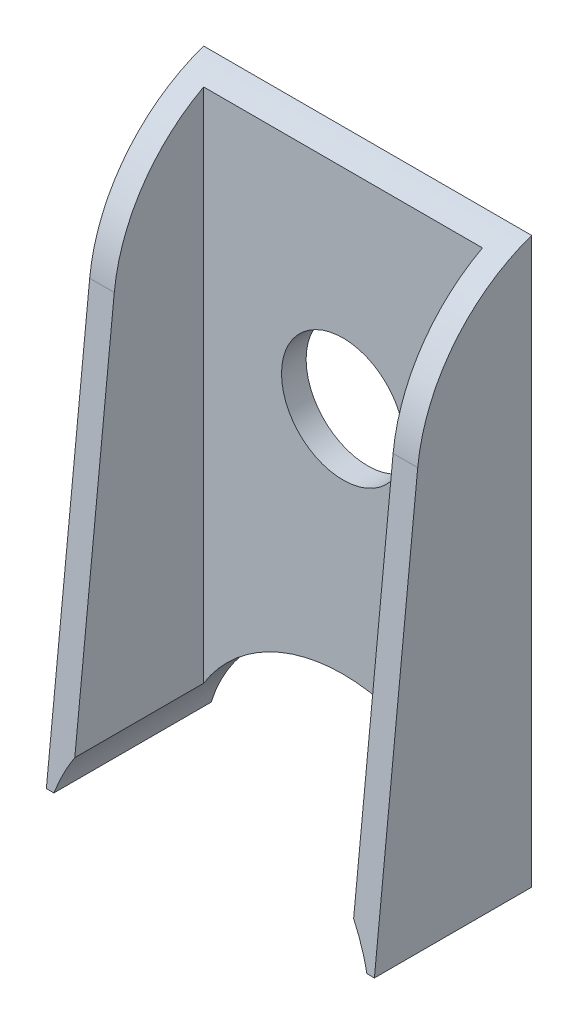
ISO-10303-21;
HEADER;
FILE_DESCRIPTION(('STEP AP214'),'2;1');
FILE_NAME('part.step','',(''),(''),'','','');
FILE_SCHEMA(('AUTOMOTIVE_DESIGN { 1 0 10303 214 1 1 1 1 }'));
ENDSEC;
DATA;
#1=APPLICATION_CONTEXT('core data for automotive mechanical design processes');
#2=APPLICATION_PROTOCOL_DEFINITION('international standard','automotive_design',2000,#1);
#3=PRODUCT_CONTEXT('',#1,'mechanical');
#4=PRODUCT('Part','Part','',(#3));
#5=PRODUCT_RELATED_PRODUCT_CATEGORY('part','',(#4));
#6=PRODUCT_DEFINITION_FORMATION('','',#4);
#7=PRODUCT_DEFINITION_CONTEXT('part definition',#1,'design');
#8=PRODUCT_DEFINITION('design','',#6,#7);
#9=PRODUCT_DEFINITION_SHAPE('','',#8);
#10=(LENGTH_UNIT() NAMED_UNIT(*) SI_UNIT(.MILLI.,.METRE.));
#11=(NAMED_UNIT(*) PLANE_ANGLE_UNIT() SI_UNIT($,.RADIAN.));
#12=(NAMED_UNIT(*) SI_UNIT($,.STERADIAN.) SOLID_ANGLE_UNIT());
#13=UNCERTAINTY_MEASURE_WITH_UNIT(LENGTH_MEASURE(1.E-05),#10,'distance_accuracy_value','');
#14=(GEOMETRIC_REPRESENTATION_CONTEXT(3) GLOBAL_UNCERTAINTY_ASSIGNED_CONTEXT((#13)) GLOBAL_UNIT_ASSIGNED_CONTEXT((#10,
#11,#12)) REPRESENTATION_CONTEXT('',''));
#15=CARTESIAN_POINT('',(0.,0.,0.));
#16=DIRECTION('',(0.,0.,1.));
#17=DIRECTION('',(1.,0.,0.));
#18=AXIS2_PLACEMENT_3D('',#15,#16,#17);
#19=CARTESIAN_POINT('',(-12.7,49.53,0.));
#20=DIRECTION('',(1.,0.,0.));
#21=DIRECTION('',(0.,0.,-1.));
#22=AXIS2_PLACEMENT_3D('',#19,#20,#21);
#23=PLANE('',#22);
#24=DIRECTION('',(0.,-1.,0.));
#25=VECTOR('',#24,1.);
#26=CARTESIAN_POINT('',(-12.7,49.53,0.));
#27=LINE('',#26,#25);
#28=CARTESIAN_POINT('',(-12.7,48.7880374490231,0.));
#29=VERTEX_POINT('',#28);
#30=CARTESIAN_POINT('',(-12.7,5.08,0.));
#31=VERTEX_POINT('',#30);
#32=EDGE_CURVE('E185',#29,#31,#27,.T.);
#33=ORIENTED_EDGE('',*,*,#32,.T.);
#34=DIRECTION('',(0.,0.,-1.));
#35=VECTOR('',#34,1.);
#36=CARTESIAN_POINT('',(-12.7,5.08,44.45));
#37=LINE('',#36,#35);
#38=CARTESIAN_POINT('',(-12.7,5.08,12.1763798862728));
#39=VERTEX_POINT('',#38);
#40=EDGE_CURVE('E128',#39,#31,#37,.T.);
#41=ORIENTED_EDGE('',*,*,#40,.F.);
#42=DIRECTION('',(0.,0.994729748210464,-0.102531595253102));
#43=VECTOR('',#42,1.);
#44=CARTESIAN_POINT('',(-12.7,50.3045931756222,7.51486283472083));
#45=LINE('',#44,#43);
#46=CARTESIAN_POINT('',(-12.7,37.6239468569937,8.82191824170788));
#47=VERTEX_POINT('',#46);
#48=EDGE_CURVE('E174',#39,#47,#45,.T.);
#49=ORIENTED_EDGE('',*,*,#48,.T.);
#50=CARTESIAN_POINT('',(-12.7,36.2637356055849,-4.37442959904211));
#51=DIRECTION('',(1.,0.,0.));
#52=DIRECTION('',(0.,0.,-1.));
#53=AXIS2_PLACEMENT_3D('',#50,#51,#52);
#54=CIRCLE('',#53,13.2662643944151);
#55=EDGE_CURVE('E176',#47,#29,#54,.F.);
#56=ORIENTED_EDGE('',*,*,#55,.T.);
#57=EDGE_LOOP('',(#33,#41,#49,#56));
#58=FACE_BOUND('',#57,.T.);
#59=ADVANCED_FACE('F41',(#58),#23,.F.);
#60=CARTESIAN_POINT('',(-10.795,49.53,12.7));
#61=DIRECTION('',(-1.,0.,0.));
#62=DIRECTION('',(0.,0.,1.));
#63=AXIS2_PLACEMENT_3D('',#60,#61,#62);
#64=PLANE('',#63);
#65=DIRECTION('',(0.,-0.994729748210464,0.102531595253102));
#66=VECTOR('',#65,1.);
#67=CARTESIAN_POINT('',(-10.795,49.0093045809145,7.64837448064018));
#68=LINE('',#67,#66);
#69=CARTESIAN_POINT('',(-10.795,37.6239468569937,8.82191824170788));
#70=VERTEX_POINT('',#69);
#71=CARTESIAN_POINT('',(-10.795,7.96014013306148,11.8795099445358));
#72=VERTEX_POINT('',#71);
#73=EDGE_CURVE('E171',#70,#72,#68,.T.);
#74=ORIENTED_EDGE('',*,*,#73,.T.);
#75=DIRECTION('',(0.,0.,-1.));
#76=VECTOR('',#75,1.);
#77=CARTESIAN_POINT('',(-10.795,7.96014013306148,44.45));
#78=LINE('',#77,#76);
#79=CARTESIAN_POINT('',(-10.795,7.9601401330615,1.905));
#80=VERTEX_POINT('',#79);
#81=EDGE_CURVE('E154',#72,#80,#78,.T.);
#82=ORIENTED_EDGE('',*,*,#81,.T.);
#83=DIRECTION('',(0.,-1.,0.));
#84=VECTOR('',#83,1.);
#85=CARTESIAN_POINT('',(-10.795,49.53,1.905));
#86=LINE('',#85,#84);
#87=CARTESIAN_POINT('',(-10.795,47.9497329910544,1.90500000000001));
#88=VERTEX_POINT('',#87);
#89=EDGE_CURVE('E192',#88,#80,#86,.T.);
#90=ORIENTED_EDGE('',*,*,#89,.F.);
#91=CARTESIAN_POINT('',(-10.795,36.2637356055849,-4.37442959904211));
#92=DIRECTION('',(-1.,0.,0.));
#93=DIRECTION('',(0.,0.,1.));
#94=AXIS2_PLACEMENT_3D('',#91,#92,#93);
#95=CIRCLE('',#94,13.2662643944151);
#96=EDGE_CURVE('E63',#88,#70,#95,.F.);
#97=ORIENTED_EDGE('',*,*,#96,.T.);
#98=EDGE_LOOP('',(#74,#82,#90,#97));
#99=FACE_BOUND('',#98,.T.);
#100=ADVANCED_FACE('F213',(#99),#64,.F.);
#101=CARTESIAN_POINT('',(-10.795,49.53,1.905));
#102=DIRECTION('',(0.,0.,-1.));
#103=DIRECTION('',(-1.,0.,0.));
#104=AXIS2_PLACEMENT_3D('',#101,#102,#103);
#105=PLANE('',#104);
#106=CARTESIAN_POINT('',(0.,31.75,1.905));
#107=DIRECTION('',(0.,0.,-1.));
#108=DIRECTION('',(-1.,0.,0.));
#109=AXIS2_PLACEMENT_3D('',#106,#107,#108);
#110=CIRCLE('',#109,4.7625);
#111=CARTESIAN_POINT('',(-4.7625,31.75,1.905));
#112=VERTEX_POINT('',#111);
#113=EDGE_CURVE('E158',#112,#112,#110,.T.);
#114=ORIENTED_EDGE('',*,*,#113,.T.);
#115=EDGE_LOOP('',(#114));
#116=FACE_BOUND('',#115,.T.);
#117=ORIENTED_EDGE('',*,*,#89,.T.);
#118=CARTESIAN_POINT('',(0.,1.27,1.905));
#119=DIRECTION('',(0.,0.,-1.));
#120=DIRECTION('',(-1.,0.,0.));
#121=AXIS2_PLACEMENT_3D('',#118,#119,#120);
#122=CIRCLE('',#121,12.7);
#123=CARTESIAN_POINT('',(10.795,7.96014013306154,1.905));
#124=VERTEX_POINT('',#123);
#125=EDGE_CURVE('E151',#80,#124,#122,.T.);
#126=ORIENTED_EDGE('',*,*,#125,.T.);
#127=DIRECTION('',(0.,-1.,0.));
#128=VECTOR('',#127,1.);
#129=CARTESIAN_POINT('',(10.795,49.53,1.905));
#130=LINE('',#129,#128);
#131=CARTESIAN_POINT('',(10.795,47.9497329910544,1.905));
#132=VERTEX_POINT('',#131);
#133=EDGE_CURVE('E189',#132,#124,#130,.T.);
#134=ORIENTED_EDGE('',*,*,#133,.F.);
#135=DIRECTION('',(1.,0.,0.));
#136=VECTOR('',#135,1.);
#137=CARTESIAN_POINT('',(-31.75,47.9497329910544,1.90500000000001));
#138=LINE('',#137,#136);
#139=EDGE_CURVE('E182',#132,#88,#138,.F.);
#140=ORIENTED_EDGE('',*,*,#139,.T.);
#141=EDGE_LOOP('',(#117,#126,#134,#140));
#142=FACE_BOUND('',#141,.T.);
#143=ADVANCED_FACE('F210',(#116,#142),#105,.F.);
#144=CARTESIAN_POINT('',(10.795,49.53,1.905));
#145=DIRECTION('',(1.,0.,0.));
#146=DIRECTION('',(0.,0.,-1.));
#147=AXIS2_PLACEMENT_3D('',#144,#145,#146);
#148=PLANE('',#147);
#149=ORIENTED_EDGE('',*,*,#133,.T.);
#150=DIRECTION('',(0.,0.,-1.));
#151=VECTOR('',#150,1.);
#152=CARTESIAN_POINT('',(10.795,7.96014013306154,44.45));
#153=LINE('',#152,#151);
#154=CARTESIAN_POINT('',(10.795,7.96014013306149,11.8795099445359));
#155=VERTEX_POINT('',#154);
#156=EDGE_CURVE('E145',#124,#155,#153,.F.);
#157=ORIENTED_EDGE('',*,*,#156,.T.);
#158=DIRECTION('',(0.,0.994729748210464,-0.102531595253102));
#159=VECTOR('',#158,1.);
#160=CARTESIAN_POINT('',(10.795,50.110299886416,7.53488958160874));
#161=LINE('',#160,#159);
#162=CARTESIAN_POINT('',(10.795,37.6239468569937,8.82191824170788));
#163=VERTEX_POINT('',#162);
#164=EDGE_CURVE('E169',#155,#163,#161,.T.);
#165=ORIENTED_EDGE('',*,*,#164,.T.);
#166=CARTESIAN_POINT('',(10.795,36.2637356055849,-4.3744295990421));
#167=DIRECTION('',(1.,0.,0.));
#168=DIRECTION('',(0.,0.,-1.));
#169=AXIS2_PLACEMENT_3D('',#166,#167,#168);
#170=CIRCLE('',#169,13.2662643944151);
#171=EDGE_CURVE('E179',#163,#132,#170,.F.);
#172=ORIENTED_EDGE('',*,*,#171,.T.);
#173=EDGE_LOOP('',(#149,#157,#165,#172));
#174=FACE_BOUND('',#173,.T.);
#175=ADVANCED_FACE('F206',(#174),#148,.F.);
#176=CARTESIAN_POINT('',(12.7,49.53,12.7));
#177=DIRECTION('',(-1.,0.,0.));
#178=DIRECTION('',(0.,0.,1.));
#179=AXIS2_PLACEMENT_3D('',#176,#177,#178);
#180=PLANE('',#179);
#181=DIRECTION('',(0.,0.994729748210464,-0.102531595253102));
#182=VECTOR('',#181,1.);
#183=CARTESIAN_POINT('',(12.7,0.,12.7));
#184=LINE('',#183,#182);
#185=CARTESIAN_POINT('',(12.7,5.07999999999999,12.1763798862728));
#186=VERTEX_POINT('',#185);
#187=CARTESIAN_POINT('',(12.7,37.6239468569937,8.82191824170788));
#188=VERTEX_POINT('',#187);
#189=EDGE_CURVE('E161',#186,#188,#184,.T.);
#190=ORIENTED_EDGE('',*,*,#189,.F.);
#191=DIRECTION('',(0.,0.,-1.));
#192=VECTOR('',#191,1.);
#193=CARTESIAN_POINT('',(12.7,5.07999999999999,44.45));
#194=LINE('',#193,#192);
#195=CARTESIAN_POINT('',(12.7,5.07999999999999,0.));
#196=VERTEX_POINT('',#195);
#197=EDGE_CURVE('E55',#186,#196,#194,.T.);
#198=ORIENTED_EDGE('',*,*,#197,.T.);
#199=DIRECTION('',(0.,-1.,0.));
#200=VECTOR('',#199,1.);
#201=CARTESIAN_POINT('',(12.7,49.53,0.));
#202=LINE('',#201,#200);
#203=CARTESIAN_POINT('',(12.7,48.7880374490231,0.));
#204=VERTEX_POINT('',#203);
#205=EDGE_CURVE('E187',#204,#196,#202,.T.);
#206=ORIENTED_EDGE('',*,*,#205,.F.);
#207=CARTESIAN_POINT('',(12.7,36.2637356055849,-4.3744295990421));
#208=DIRECTION('',(-1.,0.,0.));
#209=DIRECTION('',(0.,0.,1.));
#210=AXIS2_PLACEMENT_3D('',#207,#208,#209);
#211=CIRCLE('',#210,13.2662643944151);
#212=EDGE_CURVE('E163',#188,#204,#211,.T.);
#213=ORIENTED_EDGE('',*,*,#212,.F.);
#214=EDGE_LOOP('',(#190,#198,#206,#213));
#215=FACE_BOUND('',#214,.T.);
#216=ADVANCED_FACE('F224',(#215),#180,.F.);
#217=CARTESIAN_POINT('',(12.7,49.53,0.));
#218=DIRECTION('',(0.,0.,1.));
#219=DIRECTION('',(1.,0.,0.));
#220=AXIS2_PLACEMENT_3D('',#217,#218,#219);
#221=PLANE('',#220);
#222=CARTESIAN_POINT('',(0.,31.75,0.));
#223=DIRECTION('',(0.,0.,-1.));
#224=DIRECTION('',(-1.,0.,0.));
#225=AXIS2_PLACEMENT_3D('',#222,#223,#224);
#226=CIRCLE('',#225,4.7625);
#227=CARTESIAN_POINT('',(-4.7625,31.75,0.));
#228=VERTEX_POINT('',#227);
#229=EDGE_CURVE('E142',#228,#228,#226,.T.);
#230=ORIENTED_EDGE('',*,*,#229,.F.);
#231=EDGE_LOOP('',(#230));
#232=FACE_BOUND('',#231,.T.);
#233=CARTESIAN_POINT('',(0.,1.27,0.));
#234=DIRECTION('',(0.,0.,-1.));
#235=DIRECTION('',(-1.,0.,0.));
#236=AXIS2_PLACEMENT_3D('',#233,#234,#235);
#237=CIRCLE('',#236,12.7);
#238=CARTESIAN_POINT('',(-12.1150278579952,5.08,0.));
#239=VERTEX_POINT('',#238);
#240=CARTESIAN_POINT('',(12.1150278579952,5.07999999999999,0.));
#241=VERTEX_POINT('',#240);
#242=EDGE_CURVE('E123',#239,#241,#237,.T.);
#243=ORIENTED_EDGE('',*,*,#242,.F.);
#244=DIRECTION('',(1.,0.,0.));
#245=VECTOR('',#244,1.);
#246=CARTESIAN_POINT('',(-12.1150278579952,5.08,0.));
#247=LINE('',#246,#245);
#248=EDGE_CURVE('E131',#31,#239,#247,.T.);
#249=ORIENTED_EDGE('',*,*,#248,.F.);
#250=ORIENTED_EDGE('',*,*,#32,.F.);
#251=DIRECTION('',(1.,0.,0.));
#252=VECTOR('',#251,1.);
#253=CARTESIAN_POINT('',(-31.75,48.7880374490231,0.));
#254=LINE('',#253,#252);
#255=EDGE_CURVE('E195',#29,#204,#254,.T.);
#256=ORIENTED_EDGE('',*,*,#255,.T.);
#257=ORIENTED_EDGE('',*,*,#205,.T.);
#258=DIRECTION('',(1.,0.,0.));
#259=VECTOR('',#258,1.);
#260=CARTESIAN_POINT('',(12.1150278579952,5.07999999999999,0.));
#261=LINE('',#260,#259);
#262=EDGE_CURVE('E137',#241,#196,#261,.T.);
#263=ORIENTED_EDGE('',*,*,#262,.F.);
#264=EDGE_LOOP('',(#243,#249,#250,#256,#257,#263));
#265=FACE_BOUND('',#264,.T.);
#266=ADVANCED_FACE('F140',(#232,#265),#221,.F.);
#267=CARTESIAN_POINT('',(-31.75,36.2637356055849,-4.37442959904211));
#268=DIRECTION('',(1.,0.,0.));
#269=DIRECTION('',(0.,0.,-1.));
#270=AXIS2_PLACEMENT_3D('',#267,#268,#269);
#271=CYLINDRICAL_SURFACE('',#270,13.2662643944151);
#272=ORIENTED_EDGE('',*,*,#139,.F.);
#273=ORIENTED_EDGE('',*,*,#171,.F.);
#274=DIRECTION('',(1.,0.,0.));
#275=VECTOR('',#274,1.);
#276=CARTESIAN_POINT('',(-31.75,37.6239468569937,8.82191824170788));
#277=LINE('',#276,#275);
#278=EDGE_CURVE('E165',#163,#188,#277,.T.);
#279=ORIENTED_EDGE('',*,*,#278,.T.);
#280=ORIENTED_EDGE('',*,*,#212,.T.);
#281=ORIENTED_EDGE('',*,*,#255,.F.);
#282=ORIENTED_EDGE('',*,*,#55,.F.);
#283=EDGE_CURVE('E168',#47,#70,#277,.T.);
#284=ORIENTED_EDGE('',*,*,#283,.T.);
#285=ORIENTED_EDGE('',*,*,#96,.F.);
#286=EDGE_LOOP('',(#272,#273,#279,#280,#281,#282,#284,#285));
#287=FACE_BOUND('',#286,.T.);
#288=ADVANCED_FACE('F219',(#287),#271,.T.);
#289=CARTESIAN_POINT('',(-31.75,0.,12.7));
#290=DIRECTION('',(0.,-0.102531595253102,-0.994729748210464));
#291=DIRECTION('',(0.,0.994729748210464,-0.102531595253102));
#292=AXIS2_PLACEMENT_3D('',#289,#290,#291);
#293=PLANE('',#292);
#294=DIRECTION('',(1.,0.,0.));
#295=VECTOR('',#294,1.);
#296=CARTESIAN_POINT('',(-31.75,5.08000000000003,12.1763798862728));
#297=LINE('',#296,#295);
#298=CARTESIAN_POINT('',(-12.1150278579952,5.08,12.1763798862728));
#299=VERTEX_POINT('',#298);
#300=EDGE_CURVE('E11',#39,#299,#297,.T.);
#301=ORIENTED_EDGE('',*,*,#300,.T.);
#302=CARTESIAN_POINT('',(0.,1.27,12.5690949715682));
#303=DIRECTION('',(0.,-0.102531595253102,-0.994729748210464));
#304=DIRECTION('',(0.,0.994729748210464,-0.102531595253102));
#305=AXIS2_PLACEMENT_3D('',#302,#303,#304);
#306=ELLIPSE('',#305,12.7672868161905,12.7);
#307=EDGE_CURVE('E126',#299,#72,#306,.T.);
#308=ORIENTED_EDGE('',*,*,#307,.T.);
#309=ORIENTED_EDGE('',*,*,#73,.F.);
#310=ORIENTED_EDGE('',*,*,#283,.F.);
#311=ORIENTED_EDGE('',*,*,#48,.F.);
#312=EDGE_LOOP('',(#301,#308,#309,#310,#311));
#313=FACE_BOUND('',#312,.T.);
#314=ADVANCED_FACE('F216',(#313),#293,.F.);
#315=ORIENTED_EDGE('',*,*,#164,.F.);
#316=CARTESIAN_POINT('',(0.,1.27,12.5690949715682));
#317=DIRECTION('',(0.,-0.102531595253102,-0.994729748210464));
#318=DIRECTION('',(0.,0.994729748210464,-0.102531595253102));
#319=AXIS2_PLACEMENT_3D('',#316,#317,#318);
#320=ELLIPSE('',#319,12.7672868161905,12.7);
#321=CARTESIAN_POINT('',(12.1150278579952,5.07999999999999,12.1763798862728));
#322=VERTEX_POINT('',#321);
#323=EDGE_CURVE('E48',#155,#322,#320,.T.);
#324=ORIENTED_EDGE('',*,*,#323,.T.);
#325=DIRECTION('',(1.,0.,0.));
#326=VECTOR('',#325,1.);
#327=CARTESIAN_POINT('',(-31.75,5.07999999999999,12.1763798862728));
#328=LINE('',#327,#326);
#329=EDGE_CURVE('E198',#322,#186,#328,.T.);
#330=ORIENTED_EDGE('',*,*,#329,.T.);
#331=ORIENTED_EDGE('',*,*,#189,.T.);
#332=ORIENTED_EDGE('',*,*,#278,.F.);
#333=EDGE_LOOP('',(#315,#324,#330,#331,#332));
#334=FACE_BOUND('',#333,.T.);
#335=ADVANCED_FACE('F202',(#334),#293,.F.);
#336=CARTESIAN_POINT('',(-12.1150278579952,5.08,44.45));
#337=DIRECTION('',(0.,1.,0.));
#338=DIRECTION('',(-1.,0.,0.));
#339=AXIS2_PLACEMENT_3D('',#336,#337,#338);
#340=PLANE('',#339);
#341=ORIENTED_EDGE('',*,*,#40,.T.);
#342=ORIENTED_EDGE('',*,*,#248,.T.);
#343=DIRECTION('',(0.,0.,-1.));
#344=VECTOR('',#343,1.);
#345=CARTESIAN_POINT('',(-12.1150278579952,5.08,44.45));
#346=LINE('',#345,#344);
#347=EDGE_CURVE('E118',#299,#239,#346,.T.);
#348=ORIENTED_EDGE('',*,*,#347,.F.);
#349=ORIENTED_EDGE('',*,*,#300,.F.);
#350=EDGE_LOOP('',(#341,#342,#348,#349));
#351=FACE_BOUND('',#350,.T.);
#352=ADVANCED_FACE('F132',(#351),#340,.F.);
#353=CARTESIAN_POINT('',(0.,1.27,44.45));
#354=DIRECTION('',(0.,0.,-1.));
#355=DIRECTION('',(-1.,0.,0.));
#356=AXIS2_PLACEMENT_3D('',#353,#354,#355);
#357=CYLINDRICAL_SURFACE('',#356,12.7);
#358=ORIENTED_EDGE('',*,*,#347,.T.);
#359=ORIENTED_EDGE('',*,*,#242,.T.);
#360=DIRECTION('',(0.,0.,-1.));
#361=VECTOR('',#360,1.);
#362=CARTESIAN_POINT('',(12.1150278579952,5.07999999999999,44.45));
#363=LINE('',#362,#361);
#364=EDGE_CURVE('E138',#322,#241,#363,.T.);
#365=ORIENTED_EDGE('',*,*,#364,.F.);
#366=ORIENTED_EDGE('',*,*,#323,.F.);
#367=ORIENTED_EDGE('',*,*,#156,.F.);
#368=ORIENTED_EDGE('',*,*,#125,.F.);
#369=ORIENTED_EDGE('',*,*,#81,.F.);
#370=ORIENTED_EDGE('',*,*,#307,.F.);
#371=EDGE_LOOP('',(#358,#359,#365,#366,#367,#368,#369,#370));
#372=FACE_BOUND('',#371,.T.);
#373=ADVANCED_FACE('F120',(#372),#357,.F.);
#374=CARTESIAN_POINT('',(12.1150278579952,5.07999999999999,44.45));
#375=DIRECTION('',(0.,1.,0.));
#376=DIRECTION('',(0.,0.,1.));
#377=AXIS2_PLACEMENT_3D('',#374,#375,#376);
#378=PLANE('',#377);
#379=ORIENTED_EDGE('',*,*,#364,.T.);
#380=ORIENTED_EDGE('',*,*,#262,.T.);
#381=ORIENTED_EDGE('',*,*,#197,.F.);
#382=ORIENTED_EDGE('',*,*,#329,.F.);
#383=EDGE_LOOP('',(#379,#380,#381,#382));
#384=FACE_BOUND('',#383,.T.);
#385=ADVANCED_FACE('F228',(#384),#378,.F.);
#386=CARTESIAN_POINT('',(0.,31.75,44.45));
#387=DIRECTION('',(0.,0.,-1.));
#388=DIRECTION('',(-1.,0.,0.));
#389=AXIS2_PLACEMENT_3D('',#386,#387,#388);
#390=CYLINDRICAL_SURFACE('',#389,4.7625);
#391=ORIENTED_EDGE('',*,*,#229,.T.);
#392=EDGE_LOOP('',(#391));
#393=FACE_BOUND('',#392,.T.);
#394=ORIENTED_EDGE('',*,*,#113,.F.);
#395=EDGE_LOOP('',(#394));
#396=FACE_BOUND('',#395,.T.);
#397=ADVANCED_FACE('F230',(#393,#396),#390,.F.);
#398=CLOSED_SHELL('',(#59,#100,#143,#175,#216,#266,#288,#314,#335,#352,#373,#385,#397));
#399=MANIFOLD_SOLID_BREP('B2',#398);
#400=ADVANCED_BREP_SHAPE_REPRESENTATION('',(#18,#399),#14);
#401=SHAPE_DEFINITION_REPRESENTATION(#9,#400);
ENDSEC;
END-ISO-10303-21;
